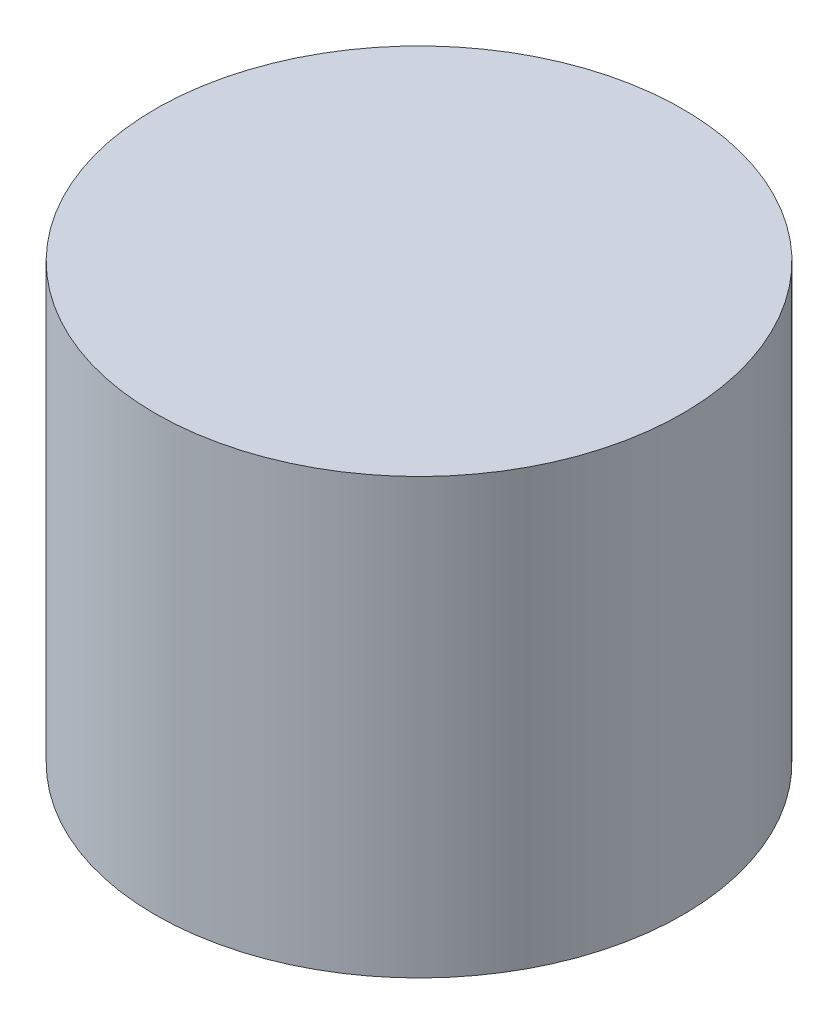
ISO-10303-21;
HEADER;
FILE_DESCRIPTION(('STEP AP214'),'2;1');
FILE_NAME('part.step','',(''),(''),'','','');
FILE_SCHEMA(('AUTOMOTIVE_DESIGN { 1 0 10303 214 1 1 1 1 }'));
ENDSEC;
DATA;
#1=APPLICATION_CONTEXT('core data for automotive mechanical design processes');
#2=APPLICATION_PROTOCOL_DEFINITION('international standard','automotive_design',2000,#1);
#3=PRODUCT_CONTEXT('',#1,'mechanical');
#4=PRODUCT('Part','Part','',(#3));
#5=PRODUCT_RELATED_PRODUCT_CATEGORY('part','',(#4));
#6=PRODUCT_DEFINITION_FORMATION('','',#4);
#7=PRODUCT_DEFINITION_CONTEXT('part definition',#1,'design');
#8=PRODUCT_DEFINITION('design','',#6,#7);
#9=PRODUCT_DEFINITION_SHAPE('','',#8);
#10=(LENGTH_UNIT() NAMED_UNIT(*) SI_UNIT(.MILLI.,.METRE.));
#11=(NAMED_UNIT(*) PLANE_ANGLE_UNIT() SI_UNIT($,.RADIAN.));
#12=(NAMED_UNIT(*) SI_UNIT($,.STERADIAN.) SOLID_ANGLE_UNIT());
#13=UNCERTAINTY_MEASURE_WITH_UNIT(LENGTH_MEASURE(1.E-05),#10,'distance_accuracy_value','');
#14=(GEOMETRIC_REPRESENTATION_CONTEXT(3) GLOBAL_UNCERTAINTY_ASSIGNED_CONTEXT((#13)) GLOBAL_UNIT_ASSIGNED_CONTEXT((#10,
#11,#12)) REPRESENTATION_CONTEXT('',''));
#15=CARTESIAN_POINT('',(0.,0.,0.));
#16=DIRECTION('',(0.,0.,1.));
#17=DIRECTION('',(1.,0.,0.));
#18=AXIS2_PLACEMENT_3D('',#15,#16,#17);
#19=CARTESIAN_POINT('',(0.,-1.4,0.));
#20=DIRECTION('',(0.,1.,0.));
#21=DIRECTION('',(0.,0.,1.));
#22=AXIS2_PLACEMENT_3D('',#19,#20,#21);
#23=CYLINDRICAL_SURFACE('',#22,1.7);
#24=CARTESIAN_POINT('',(0.,-1.4,0.));
#25=DIRECTION('',(0.,1.,0.));
#26=DIRECTION('',(0.,0.,1.));
#27=AXIS2_PLACEMENT_3D('',#24,#25,#26);
#28=CIRCLE('',#27,1.7);
#29=CARTESIAN_POINT('',(0.,-1.4,1.7));
#30=VERTEX_POINT('',#29);
#31=EDGE_CURVE('E10',#30,#30,#28,.T.);
#32=ORIENTED_EDGE('',*,*,#31,.T.);
#33=EDGE_LOOP('',(#32));
#34=FACE_BOUND('',#33,.T.);
#35=CARTESIAN_POINT('',(0.,1.4,0.));
#36=DIRECTION('',(0.,1.,0.));
#37=DIRECTION('',(0.,0.,1.));
#38=AXIS2_PLACEMENT_3D('',#35,#36,#37);
#39=CIRCLE('',#38,1.7);
#40=CARTESIAN_POINT('',(0.,1.4,1.7));
#41=VERTEX_POINT('',#40);
#42=EDGE_CURVE('E44',#41,#41,#39,.T.);
#43=ORIENTED_EDGE('',*,*,#42,.F.);
#44=EDGE_LOOP('',(#43));
#45=FACE_BOUND('',#44,.T.);
#46=ADVANCED_FACE('F37',(#34,#45),#23,.T.);
#47=CARTESIAN_POINT('',(0.,-1.4,0.));
#48=DIRECTION('',(0.,1.,0.));
#49=DIRECTION('',(0.,0.,1.));
#50=AXIS2_PLACEMENT_3D('',#47,#48,#49);
#51=PLANE('',#50);
#52=ORIENTED_EDGE('',*,*,#31,.F.);
#53=EDGE_LOOP('',(#52));
#54=FACE_BOUND('',#53,.T.);
#55=ADVANCED_FACE('F54',(#54),#51,.F.);
#56=CARTESIAN_POINT('',(0.,1.4,0.));
#57=DIRECTION('',(0.,1.,0.));
#58=DIRECTION('',(0.,0.,1.));
#59=AXIS2_PLACEMENT_3D('',#56,#57,#58);
#60=PLANE('',#59);
#61=ORIENTED_EDGE('',*,*,#42,.T.);
#62=EDGE_LOOP('',(#61));
#63=FACE_BOUND('',#62,.T.);
#64=ADVANCED_FACE('F51',(#63),#60,.T.);
#65=CLOSED_SHELL('',(#46,#55,#64));
#66=MANIFOLD_SOLID_BREP('B2',#65);
#67=ADVANCED_BREP_SHAPE_REPRESENTATION('',(#18,#66),#14);
#68=SHAPE_DEFINITION_REPRESENTATION(#9,#67);
ENDSEC;
END-ISO-10303-21;
